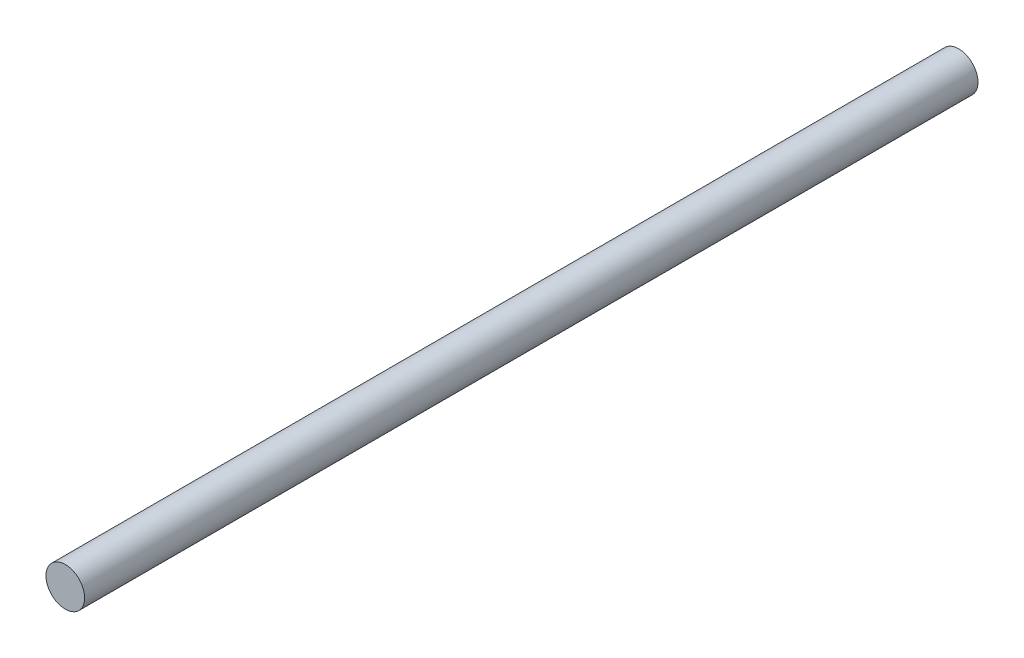
ISO-10303-21;
HEADER;
FILE_DESCRIPTION(('STEP AP214'),'2;1');
FILE_NAME('part.step','',(''),(''),'','','');
FILE_SCHEMA(('AUTOMOTIVE_DESIGN { 1 0 10303 214 1 1 1 1 }'));
ENDSEC;
DATA;
#1=APPLICATION_CONTEXT('core data for automotive mechanical design processes');
#2=APPLICATION_PROTOCOL_DEFINITION('international standard','automotive_design',2000,#1);
#3=PRODUCT_CONTEXT('',#1,'mechanical');
#4=PRODUCT('Part','Part','',(#3));
#5=PRODUCT_RELATED_PRODUCT_CATEGORY('part','',(#4));
#6=PRODUCT_DEFINITION_FORMATION('','',#4);
#7=PRODUCT_DEFINITION_CONTEXT('part definition',#1,'design');
#8=PRODUCT_DEFINITION('design','',#6,#7);
#9=PRODUCT_DEFINITION_SHAPE('','',#8);
#10=(LENGTH_UNIT() NAMED_UNIT(*) SI_UNIT(.MILLI.,.METRE.));
#11=(NAMED_UNIT(*) PLANE_ANGLE_UNIT() SI_UNIT($,.RADIAN.));
#12=(NAMED_UNIT(*) SI_UNIT($,.STERADIAN.) SOLID_ANGLE_UNIT());
#13=UNCERTAINTY_MEASURE_WITH_UNIT(LENGTH_MEASURE(1.E-05),#10,'distance_accuracy_value','');
#14=(GEOMETRIC_REPRESENTATION_CONTEXT(3) GLOBAL_UNCERTAINTY_ASSIGNED_CONTEXT((#13)) GLOBAL_UNIT_ASSIGNED_CONTEXT((#10,
#11,#12)) REPRESENTATION_CONTEXT('',''));
#15=CARTESIAN_POINT('',(0.,0.,0.));
#16=DIRECTION('',(0.,0.,1.));
#17=DIRECTION('',(1.,0.,0.));
#18=AXIS2_PLACEMENT_3D('',#15,#16,#17);
#19=CARTESIAN_POINT('',(0.,0.,180.));
#20=DIRECTION('',(0.,0.,-1.));
#21=DIRECTION('',(-1.,0.,0.));
#22=AXIS2_PLACEMENT_3D('',#19,#20,#21);
#23=CYLINDRICAL_SURFACE('',#22,3.9);
#24=CARTESIAN_POINT('',(0.,0.,180.));
#25=DIRECTION('',(0.,0.,1.));
#26=DIRECTION('',(1.,0.,0.));
#27=AXIS2_PLACEMENT_3D('',#24,#25,#26);
#28=CIRCLE('',#27,3.9);
#29=CARTESIAN_POINT('',(3.9,0.,180.));
#30=VERTEX_POINT('',#29);
#31=EDGE_CURVE('E11',#30,#30,#28,.T.);
#32=ORIENTED_EDGE('',*,*,#31,.F.);
#33=EDGE_LOOP('',(#32));
#34=FACE_BOUND('',#33,.T.);
#35=CARTESIAN_POINT('',(0.,0.,0.));
#36=DIRECTION('',(0.,0.,1.));
#37=DIRECTION('',(1.,0.,0.));
#38=AXIS2_PLACEMENT_3D('',#35,#36,#37);
#39=CIRCLE('',#38,3.9);
#40=CARTESIAN_POINT('',(3.9,0.,0.));
#41=VERTEX_POINT('',#40);
#42=EDGE_CURVE('E25',#41,#41,#39,.T.);
#43=ORIENTED_EDGE('',*,*,#42,.T.);
#44=EDGE_LOOP('',(#43));
#45=FACE_BOUND('',#44,.T.);
#46=ADVANCED_FACE('F18',(#34,#45),#23,.T.);
#47=CARTESIAN_POINT('',(0.,0.,180.));
#48=DIRECTION('',(0.,0.,1.));
#49=DIRECTION('',(1.,0.,0.));
#50=AXIS2_PLACEMENT_3D('',#47,#48,#49);
#51=PLANE('',#50);
#52=ORIENTED_EDGE('',*,*,#31,.T.);
#53=EDGE_LOOP('',(#52));
#54=FACE_BOUND('',#53,.T.);
#55=ADVANCED_FACE('F37',(#54),#51,.T.);
#56=CARTESIAN_POINT('',(0.,0.,0.));
#57=DIRECTION('',(0.,0.,1.));
#58=DIRECTION('',(1.,0.,0.));
#59=AXIS2_PLACEMENT_3D('',#56,#57,#58);
#60=PLANE('',#59);
#61=ORIENTED_EDGE('',*,*,#42,.F.);
#62=EDGE_LOOP('',(#61));
#63=FACE_BOUND('',#62,.T.);
#64=ADVANCED_FACE('F35',(#63),#60,.F.);
#65=CLOSED_SHELL('',(#46,#55,#64));
#66=MANIFOLD_SOLID_BREP('B1',#65);
#67=ADVANCED_BREP_SHAPE_REPRESENTATION('',(#18,#66),#14);
#68=SHAPE_DEFINITION_REPRESENTATION(#9,#67);
ENDSEC;
END-ISO-10303-21;
